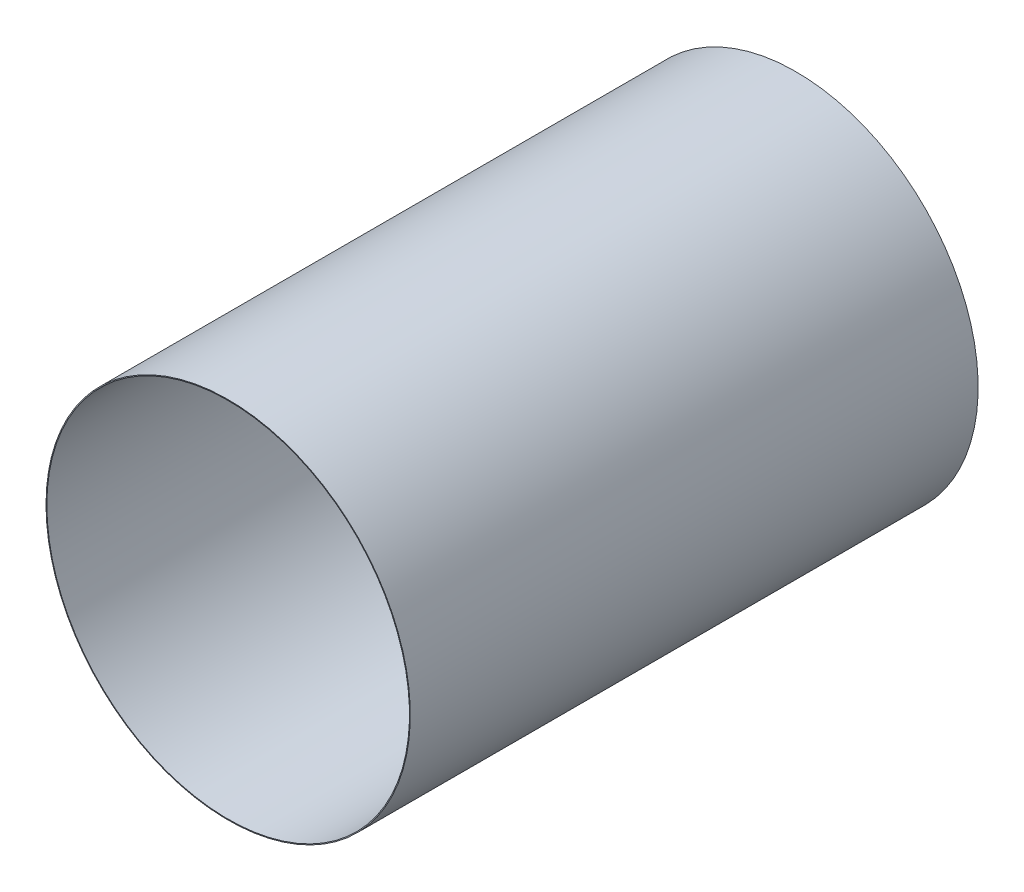
ISO-10303-21;
HEADER;
FILE_DESCRIPTION(('STEP AP214'),'2;1');
FILE_NAME('part.step','',(''),(''),'','','');
FILE_SCHEMA(('AUTOMOTIVE_DESIGN { 1 0 10303 214 1 1 1 1 }'));
ENDSEC;
DATA;
#1=APPLICATION_CONTEXT('core data for automotive mechanical design processes');
#2=APPLICATION_PROTOCOL_DEFINITION('international standard','automotive_design',2000,#1);
#3=PRODUCT_CONTEXT('',#1,'mechanical');
#4=PRODUCT('Part','Part','',(#3));
#5=PRODUCT_RELATED_PRODUCT_CATEGORY('part','',(#4));
#6=PRODUCT_DEFINITION_FORMATION('','',#4);
#7=PRODUCT_DEFINITION_CONTEXT('part definition',#1,'design');
#8=PRODUCT_DEFINITION('design','',#6,#7);
#9=PRODUCT_DEFINITION_SHAPE('','',#8);
#10=(LENGTH_UNIT() NAMED_UNIT(*) SI_UNIT(.MILLI.,.METRE.));
#11=(NAMED_UNIT(*) PLANE_ANGLE_UNIT() SI_UNIT($,.RADIAN.));
#12=(NAMED_UNIT(*) SI_UNIT($,.STERADIAN.) SOLID_ANGLE_UNIT());
#13=UNCERTAINTY_MEASURE_WITH_UNIT(LENGTH_MEASURE(1.E-05),#10,'distance_accuracy_value','');
#14=(GEOMETRIC_REPRESENTATION_CONTEXT(3) GLOBAL_UNCERTAINTY_ASSIGNED_CONTEXT((#13)) GLOBAL_UNIT_ASSIGNED_CONTEXT((#10,
#11,#12)) REPRESENTATION_CONTEXT('',''));
#15=CARTESIAN_POINT('',(0.,0.,0.));
#16=DIRECTION('',(0.,0.,1.));
#17=DIRECTION('',(1.,0.,0.));
#18=AXIS2_PLACEMENT_3D('',#15,#16,#17);
#19=CARTESIAN_POINT('',(0.,0.,0.));
#20=DIRECTION('',(0.,0.,1.));
#21=DIRECTION('',(1.,0.,0.));
#22=AXIS2_PLACEMENT_3D('',#19,#20,#21);
#23=CYLINDRICAL_SURFACE('',#22,216.5);
#24=CARTESIAN_POINT('',(0.,0.,0.));
#25=DIRECTION('',(0.,0.,-1.));
#26=DIRECTION('',(1.,0.,0.));
#27=AXIS2_PLACEMENT_3D('',#24,#25,#26);
#28=CIRCLE('',#27,216.5);
#29=CARTESIAN_POINT('',(-216.5,0.,0.));
#30=VERTEX_POINT('',#29);
#31=EDGE_CURVE('E66',#30,#30,#28,.T.);
#32=ORIENTED_EDGE('',*,*,#31,.T.);
#33=DIRECTION('',(0.,0.,1.));
#34=VECTOR('',#33,1.);
#35=CARTESIAN_POINT('',(-216.5,0.,0.));
#36=LINE('',#35,#34);
#37=CARTESIAN_POINT('',(-216.5,0.,678.));
#38=VERTEX_POINT('',#37);
#39=EDGE_CURVE('E11',#30,#38,#36,.T.);
#40=ORIENTED_EDGE('',*,*,#39,.T.);
#41=CARTESIAN_POINT('',(0.,0.,678.));
#42=DIRECTION('',(0.,0.,-1.));
#43=DIRECTION('',(1.,0.,0.));
#44=AXIS2_PLACEMENT_3D('',#41,#42,#43);
#45=CIRCLE('',#44,216.5);
#46=EDGE_CURVE('E27',#38,#38,#45,.T.);
#47=ORIENTED_EDGE('',*,*,#46,.F.);
#48=ORIENTED_EDGE('',*,*,#39,.F.);
#49=EDGE_LOOP('',(#32,#40,#47,#48));
#50=FACE_BOUND('',#49,.T.);
#51=ADVANCED_FACE('F17',(#50),#23,.F.);
#52=CARTESIAN_POINT('',(0.,0.,678.));
#53=DIRECTION('',(0.,0.,1.));
#54=DIRECTION('',(1.,0.,0.));
#55=AXIS2_PLACEMENT_3D('',#52,#53,#54);
#56=PLANE('',#55);
#57=ORIENTED_EDGE('',*,*,#46,.T.);
#58=EDGE_LOOP('',(#57));
#59=FACE_BOUND('',#58,.T.);
#60=CARTESIAN_POINT('',(0.,0.,678.));
#61=DIRECTION('',(0.,0.,1.));
#62=DIRECTION('',(1.,0.,0.));
#63=AXIS2_PLACEMENT_3D('',#60,#61,#62);
#64=CIRCLE('',#63,217.5);
#65=CARTESIAN_POINT('',(-217.5,0.,678.));
#66=VERTEX_POINT('',#65);
#67=EDGE_CURVE('E21',#66,#66,#64,.T.);
#68=ORIENTED_EDGE('',*,*,#67,.T.);
#69=EDGE_LOOP('',(#68));
#70=FACE_BOUND('',#69,.T.);
#71=ADVANCED_FACE('F88',(#59,#70),#56,.T.);
#72=CARTESIAN_POINT('',(0.,0.,0.));
#73=DIRECTION('',(0.,0.,1.));
#74=DIRECTION('',(1.,0.,0.));
#75=AXIS2_PLACEMENT_3D('',#72,#73,#74);
#76=CYLINDRICAL_SURFACE('',#75,217.5);
#77=ORIENTED_EDGE('',*,*,#67,.F.);
#78=DIRECTION('',(0.,0.,-1.));
#79=VECTOR('',#78,1.);
#80=CARTESIAN_POINT('',(-217.5,0.,0.));
#81=LINE('',#80,#79);
#82=CARTESIAN_POINT('',(-217.5,0.,0.));
#83=VERTEX_POINT('',#82);
#84=EDGE_CURVE('E50',#66,#83,#81,.T.);
#85=ORIENTED_EDGE('',*,*,#84,.T.);
#86=CARTESIAN_POINT('',(0.,0.,0.));
#87=DIRECTION('',(0.,0.,1.));
#88=DIRECTION('',(1.,0.,0.));
#89=AXIS2_PLACEMENT_3D('',#86,#87,#88);
#90=CIRCLE('',#89,217.5);
#91=EDGE_CURVE('E57',#83,#83,#90,.T.);
#92=ORIENTED_EDGE('',*,*,#91,.T.);
#93=ORIENTED_EDGE('',*,*,#84,.F.);
#94=EDGE_LOOP('',(#77,#85,#92,#93));
#95=FACE_BOUND('',#94,.T.);
#96=ADVANCED_FACE('F19',(#95),#76,.T.);
#97=CARTESIAN_POINT('',(0.,0.,0.));
#98=DIRECTION('',(0.,0.,1.));
#99=DIRECTION('',(1.,0.,0.));
#100=AXIS2_PLACEMENT_3D('',#97,#98,#99);
#101=PLANE('',#100);
#102=ORIENTED_EDGE('',*,*,#31,.F.);
#103=EDGE_LOOP('',(#102));
#104=FACE_BOUND('',#103,.T.);
#105=ORIENTED_EDGE('',*,*,#91,.F.);
#106=EDGE_LOOP('',(#105));
#107=FACE_BOUND('',#106,.T.);
#108=ADVANCED_FACE('F101',(#104,#107),#101,.F.);
#109=CLOSED_SHELL('',(#51,#71,#96,#108));
#110=MANIFOLD_SOLID_BREP('B1',#109);
#111=ADVANCED_BREP_SHAPE_REPRESENTATION('',(#18,#110),#14);
#112=SHAPE_DEFINITION_REPRESENTATION(#9,#111);
ENDSEC;
END-ISO-10303-21;
